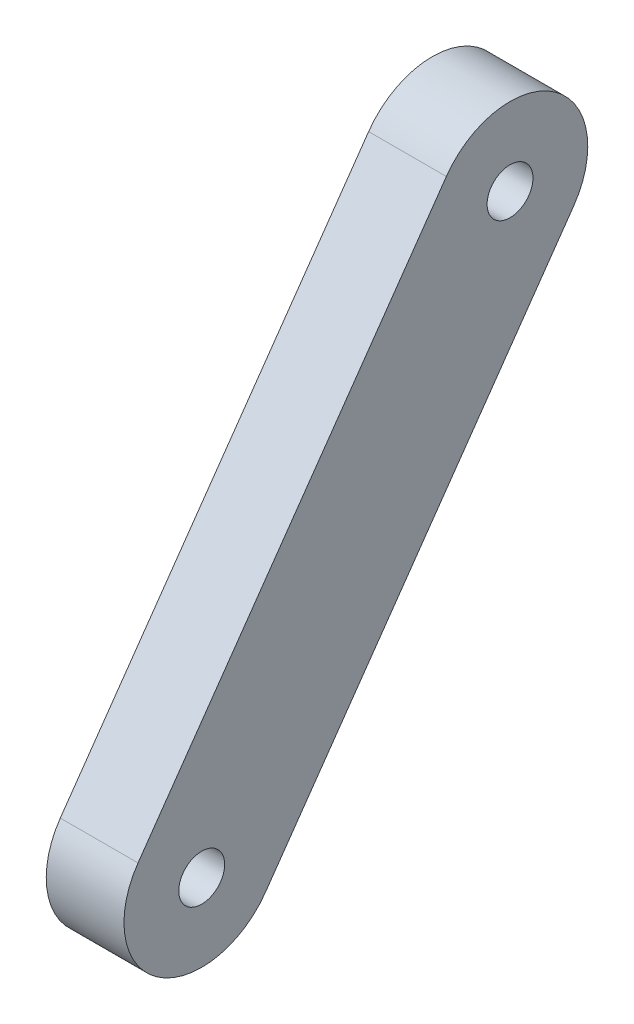
ISO-10303-21;
HEADER;
FILE_DESCRIPTION(('STEP AP214'),'2;1');
FILE_NAME('part.step','',(''),(''),'','','');
FILE_SCHEMA(('AUTOMOTIVE_DESIGN { 1 0 10303 214 1 1 1 1 }'));
ENDSEC;
DATA;
#1=APPLICATION_CONTEXT('core data for automotive mechanical design processes');
#2=APPLICATION_PROTOCOL_DEFINITION('international standard','automotive_design',2000,#1);
#3=PRODUCT_CONTEXT('',#1,'mechanical');
#4=PRODUCT('Part','Part','',(#3));
#5=PRODUCT_RELATED_PRODUCT_CATEGORY('part','',(#4));
#6=PRODUCT_DEFINITION_FORMATION('','',#4);
#7=PRODUCT_DEFINITION_CONTEXT('part definition',#1,'design');
#8=PRODUCT_DEFINITION('design','',#6,#7);
#9=PRODUCT_DEFINITION_SHAPE('','',#8);
#10=(LENGTH_UNIT() NAMED_UNIT(*) SI_UNIT(.MILLI.,.METRE.));
#11=(NAMED_UNIT(*) PLANE_ANGLE_UNIT() SI_UNIT($,.RADIAN.));
#12=(NAMED_UNIT(*) SI_UNIT($,.STERADIAN.) SOLID_ANGLE_UNIT());
#13=UNCERTAINTY_MEASURE_WITH_UNIT(LENGTH_MEASURE(1.E-05),#10,'distance_accuracy_value','');
#14=(GEOMETRIC_REPRESENTATION_CONTEXT(3) GLOBAL_UNCERTAINTY_ASSIGNED_CONTEXT((#13)) GLOBAL_UNIT_ASSIGNED_CONTEXT((#10,
#11,#12)) REPRESENTATION_CONTEXT('',''));
#15=CARTESIAN_POINT('',(0.,0.,0.));
#16=DIRECTION('',(0.,0.,1.));
#17=DIRECTION('',(1.,0.,0.));
#18=AXIS2_PLACEMENT_3D('',#15,#16,#17);
#19=CARTESIAN_POINT('',(2.54,60.125962298,0.));
#20=DIRECTION('',(1.,0.,0.));
#21=DIRECTION('',(0.,0.,-1.));
#22=AXIS2_PLACEMENT_3D('',#19,#20,#21);
#23=PLANE('',#22);
#24=CARTESIAN_POINT('',(2.54,88.9,-20.1477981036707));
#25=DIRECTION('',(1.,0.,0.));
#26=DIRECTION('',(0.,0.,-1.));
#27=AXIS2_PLACEMENT_3D('',#24,#25,#26);
#28=CIRCLE('',#27,1.5);
#29=CARTESIAN_POINT('',(2.54,88.9,-21.6477981036707));
#30=VERTEX_POINT('',#29);
#31=EDGE_CURVE('E106',#30,#30,#28,.T.);
#32=ORIENTED_EDGE('',*,*,#31,.F.);
#33=EDGE_LOOP('',(#32));
#34=FACE_BOUND('',#33,.T.);
#35=CARTESIAN_POINT('',(2.54,60.125962298,0.));
#36=DIRECTION('',(1.,0.,0.));
#37=DIRECTION('',(0.,0.,-1.));
#38=AXIS2_PLACEMENT_3D('',#35,#36,#37);
#39=CIRCLE('',#38,5.08);
#40=CARTESIAN_POINT('',(2.54,63.0397305946633,4.16129238498809));
#41=VERTEX_POINT('',#40);
#42=CARTESIAN_POINT('',(2.54,57.2121940013367,-4.16129238498808));
#43=VERTEX_POINT('',#42);
#44=EDGE_CURVE('E91',#41,#43,#39,.T.);
#45=ORIENTED_EDGE('',*,*,#44,.T.);
#46=DIRECTION('',(0.,0.819152044288993,-0.573576436351044));
#47=VECTOR('',#46,1.);
#48=CARTESIAN_POINT('',(2.54,57.2121940013367,-4.16129238498808));
#49=LINE('',#48,#47);
#50=CARTESIAN_POINT('',(2.54,85.9862317033367,-24.3090904886588));
#51=VERTEX_POINT('',#50);
#52=EDGE_CURVE('E86',#43,#51,#49,.T.);
#53=ORIENTED_EDGE('',*,*,#52,.T.);
#54=CARTESIAN_POINT('',(2.54,88.9,-20.1477981036707));
#55=DIRECTION('',(1.,0.,0.));
#56=DIRECTION('',(0.,0.,-1.));
#57=AXIS2_PLACEMENT_3D('',#54,#55,#56);
#58=CIRCLE('',#57,5.08);
#59=CARTESIAN_POINT('',(2.54,91.8137682966633,-15.9865057186826));
#60=VERTEX_POINT('',#59);
#61=EDGE_CURVE('E89',#51,#60,#58,.T.);
#62=ORIENTED_EDGE('',*,*,#61,.T.);
#63=DIRECTION('',(0.,-0.819152044288993,0.573576436351044));
#64=VECTOR('',#63,1.);
#65=CARTESIAN_POINT('',(2.54,63.0397305946633,4.16129238498809));
#66=LINE('',#65,#64);
#67=EDGE_CURVE('E56',#60,#41,#66,.T.);
#68=ORIENTED_EDGE('',*,*,#67,.T.);
#69=EDGE_LOOP('',(#45,#53,#62,#68));
#70=FACE_BOUND('',#69,.T.);
#71=CARTESIAN_POINT('',(2.54,60.125962298,0.));
#72=DIRECTION('',(1.,0.,0.));
#73=DIRECTION('',(0.,0.,-1.));
#74=AXIS2_PLACEMENT_3D('',#71,#72,#73);
#75=CIRCLE('',#74,1.5);
#76=CARTESIAN_POINT('',(2.54,60.125962298,-1.5));
#77=VERTEX_POINT('',#76);
#78=EDGE_CURVE('E121',#77,#77,#75,.T.);
#79=ORIENTED_EDGE('',*,*,#78,.F.);
#80=EDGE_LOOP('',(#79));
#81=FACE_BOUND('',#80,.T.);
#82=ADVANCED_FACE('F39',(#34,#70,#81),#23,.T.);
#83=CARTESIAN_POINT('',(-2.54,60.125962298,0.));
#84=DIRECTION('',(1.,0.,0.));
#85=DIRECTION('',(0.,0.,-1.));
#86=AXIS2_PLACEMENT_3D('',#83,#84,#85);
#87=PLANE('',#86);
#88=CARTESIAN_POINT('',(-2.54,60.125962298,0.));
#89=DIRECTION('',(1.,0.,0.));
#90=DIRECTION('',(0.,0.,-1.));
#91=AXIS2_PLACEMENT_3D('',#88,#89,#90);
#92=CIRCLE('',#91,5.08);
#93=CARTESIAN_POINT('',(-2.54,63.0397305946633,4.16129238498809));
#94=VERTEX_POINT('',#93);
#95=CARTESIAN_POINT('',(-2.54,57.2121940013367,-4.16129238498808));
#96=VERTEX_POINT('',#95);
#97=EDGE_CURVE('E103',#94,#96,#92,.T.);
#98=ORIENTED_EDGE('',*,*,#97,.F.);
#99=DIRECTION('',(0.,-0.819152044288993,0.573576436351044));
#100=VECTOR('',#99,1.);
#101=CARTESIAN_POINT('',(-2.54,63.0397305946633,4.16129238498809));
#102=LINE('',#101,#100);
#103=CARTESIAN_POINT('',(-2.54,91.8137682966633,-15.9865057186826));
#104=VERTEX_POINT('',#103);
#105=EDGE_CURVE('E79',#104,#94,#102,.T.);
#106=ORIENTED_EDGE('',*,*,#105,.F.);
#107=CARTESIAN_POINT('',(-2.54,88.9,-20.1477981036707));
#108=DIRECTION('',(1.,0.,0.));
#109=DIRECTION('',(0.,0.,-1.));
#110=AXIS2_PLACEMENT_3D('',#107,#108,#109);
#111=CIRCLE('',#110,5.08);
#112=CARTESIAN_POINT('',(-2.54,85.9862317033367,-24.3090904886588));
#113=VERTEX_POINT('',#112);
#114=EDGE_CURVE('E73',#113,#104,#111,.T.);
#115=ORIENTED_EDGE('',*,*,#114,.F.);
#116=DIRECTION('',(0.,0.819152044288993,-0.573576436351044));
#117=VECTOR('',#116,1.);
#118=CARTESIAN_POINT('',(-2.54,57.2121940013367,-4.16129238498808));
#119=LINE('',#118,#117);
#120=EDGE_CURVE('E95',#96,#113,#119,.T.);
#121=ORIENTED_EDGE('',*,*,#120,.F.);
#122=EDGE_LOOP('',(#98,#106,#115,#121));
#123=FACE_BOUND('',#122,.T.);
#124=CARTESIAN_POINT('',(-2.54,88.9,-20.1477981036707));
#125=DIRECTION('',(1.,0.,0.));
#126=DIRECTION('',(0.,0.,-1.));
#127=AXIS2_PLACEMENT_3D('',#124,#125,#126);
#128=CIRCLE('',#127,1.5);
#129=CARTESIAN_POINT('',(-2.54,88.9,-21.6477981036707));
#130=VERTEX_POINT('',#129);
#131=EDGE_CURVE('E118',#130,#130,#128,.T.);
#132=ORIENTED_EDGE('',*,*,#131,.T.);
#133=EDGE_LOOP('',(#132));
#134=FACE_BOUND('',#133,.T.);
#135=CARTESIAN_POINT('',(-2.54,60.125962298,0.));
#136=DIRECTION('',(1.,0.,0.));
#137=DIRECTION('',(0.,0.,-1.));
#138=AXIS2_PLACEMENT_3D('',#135,#136,#137);
#139=CIRCLE('',#138,1.5);
#140=CARTESIAN_POINT('',(-2.54,60.125962298,-1.5));
#141=VERTEX_POINT('',#140);
#142=EDGE_CURVE('E124',#141,#141,#139,.T.);
#143=ORIENTED_EDGE('',*,*,#142,.T.);
#144=EDGE_LOOP('',(#143));
#145=FACE_BOUND('',#144,.T.);
#146=ADVANCED_FACE('F114',(#123,#134,#145),#87,.F.);
#147=CARTESIAN_POINT('',(2.54,60.125962298,0.));
#148=DIRECTION('',(-1.,0.,0.));
#149=DIRECTION('',(0.,0.,1.));
#150=AXIS2_PLACEMENT_3D('',#147,#148,#149);
#151=CYLINDRICAL_SURFACE('',#150,5.08);
#152=ORIENTED_EDGE('',*,*,#97,.T.);
#153=DIRECTION('',(-1.,0.,0.));
#154=VECTOR('',#153,1.);
#155=CARTESIAN_POINT('',(2.54,57.2121940013367,-4.16129238498808));
#156=LINE('',#155,#154);
#157=EDGE_CURVE('E11',#43,#96,#156,.T.);
#158=ORIENTED_EDGE('',*,*,#157,.F.);
#159=ORIENTED_EDGE('',*,*,#44,.F.);
#160=DIRECTION('',(-1.,0.,0.));
#161=VECTOR('',#160,1.);
#162=CARTESIAN_POINT('',(2.54,63.0397305946633,4.16129238498809));
#163=LINE('',#162,#161);
#164=EDGE_CURVE('E99',#41,#94,#163,.T.);
#165=ORIENTED_EDGE('',*,*,#164,.T.);
#166=EDGE_LOOP('',(#152,#158,#159,#165));
#167=FACE_BOUND('',#166,.T.);
#168=ADVANCED_FACE('F41',(#167),#151,.T.);
#169=CARTESIAN_POINT('',(2.54,57.2121940013367,-4.16129238498808));
#170=DIRECTION('',(0.,0.573576436351044,0.819152044288993));
#171=DIRECTION('',(0.,-0.819152044288993,0.573576436351044));
#172=AXIS2_PLACEMENT_3D('',#169,#170,#171);
#173=PLANE('',#172);
#174=ORIENTED_EDGE('',*,*,#120,.T.);
#175=DIRECTION('',(-1.,0.,0.));
#176=VECTOR('',#175,1.);
#177=CARTESIAN_POINT('',(2.54,85.9862317033367,-24.3090904886588));
#178=LINE('',#177,#176);
#179=EDGE_CURVE('E48',#51,#113,#178,.T.);
#180=ORIENTED_EDGE('',*,*,#179,.F.);
#181=ORIENTED_EDGE('',*,*,#52,.F.);
#182=ORIENTED_EDGE('',*,*,#157,.T.);
#183=EDGE_LOOP('',(#174,#180,#181,#182));
#184=FACE_BOUND('',#183,.T.);
#185=ADVANCED_FACE('F94',(#184),#173,.F.);
#186=CARTESIAN_POINT('',(2.54,88.9,-20.1477981036707));
#187=DIRECTION('',(-1.,0.,0.));
#188=DIRECTION('',(0.,0.,1.));
#189=AXIS2_PLACEMENT_3D('',#186,#187,#188);
#190=CYLINDRICAL_SURFACE('',#189,5.08);
#191=ORIENTED_EDGE('',*,*,#114,.T.);
#192=DIRECTION('',(-1.,0.,0.));
#193=VECTOR('',#192,1.);
#194=CARTESIAN_POINT('',(2.54,91.8137682966633,-15.9865057186826));
#195=LINE('',#194,#193);
#196=EDGE_CURVE('E96',#60,#104,#195,.T.);
#197=ORIENTED_EDGE('',*,*,#196,.F.);
#198=ORIENTED_EDGE('',*,*,#61,.F.);
#199=ORIENTED_EDGE('',*,*,#179,.T.);
#200=EDGE_LOOP('',(#191,#197,#198,#199));
#201=FACE_BOUND('',#200,.T.);
#202=ADVANCED_FACE('F97',(#201),#190,.T.);
#203=CARTESIAN_POINT('',(2.54,63.0397305946633,4.16129238498809));
#204=DIRECTION('',(0.,-0.573576436351044,-0.819152044288993));
#205=DIRECTION('',(0.,0.819152044288993,-0.573576436351044));
#206=AXIS2_PLACEMENT_3D('',#203,#204,#205);
#207=PLANE('',#206);
#208=ORIENTED_EDGE('',*,*,#105,.T.);
#209=ORIENTED_EDGE('',*,*,#164,.F.);
#210=ORIENTED_EDGE('',*,*,#67,.F.);
#211=ORIENTED_EDGE('',*,*,#196,.T.);
#212=EDGE_LOOP('',(#208,#209,#210,#211));
#213=FACE_BOUND('',#212,.T.);
#214=ADVANCED_FACE('F111',(#213),#207,.F.);
#215=CARTESIAN_POINT('',(2.54,88.9,-20.1477981036707));
#216=DIRECTION('',(-1.,0.,0.));
#217=DIRECTION('',(0.,0.,1.));
#218=AXIS2_PLACEMENT_3D('',#215,#216,#217);
#219=CYLINDRICAL_SURFACE('',#218,1.5);
#220=ORIENTED_EDGE('',*,*,#31,.T.);
#221=EDGE_LOOP('',(#220));
#222=FACE_BOUND('',#221,.T.);
#223=ORIENTED_EDGE('',*,*,#131,.F.);
#224=EDGE_LOOP('',(#223));
#225=FACE_BOUND('',#224,.T.);
#226=ADVANCED_FACE('F141',(#222,#225),#219,.F.);
#227=CARTESIAN_POINT('',(2.54,60.125962298,0.));
#228=DIRECTION('',(-1.,0.,0.));
#229=DIRECTION('',(0.,0.,1.));
#230=AXIS2_PLACEMENT_3D('',#227,#228,#229);
#231=CYLINDRICAL_SURFACE('',#230,1.5);
#232=ORIENTED_EDGE('',*,*,#78,.T.);
#233=EDGE_LOOP('',(#232));
#234=FACE_BOUND('',#233,.T.);
#235=ORIENTED_EDGE('',*,*,#142,.F.);
#236=EDGE_LOOP('',(#235));
#237=FACE_BOUND('',#236,.T.);
#238=ADVANCED_FACE('F130',(#234,#237),#231,.F.);
#239=CLOSED_SHELL('',(#82,#146,#168,#185,#202,#214,#226,#238));
#240=MANIFOLD_SOLID_BREP('B2',#239);
#241=ADVANCED_BREP_SHAPE_REPRESENTATION('',(#18,#240),#14);
#242=SHAPE_DEFINITION_REPRESENTATION(#9,#241);
ENDSEC;
END-ISO-10303-21;
